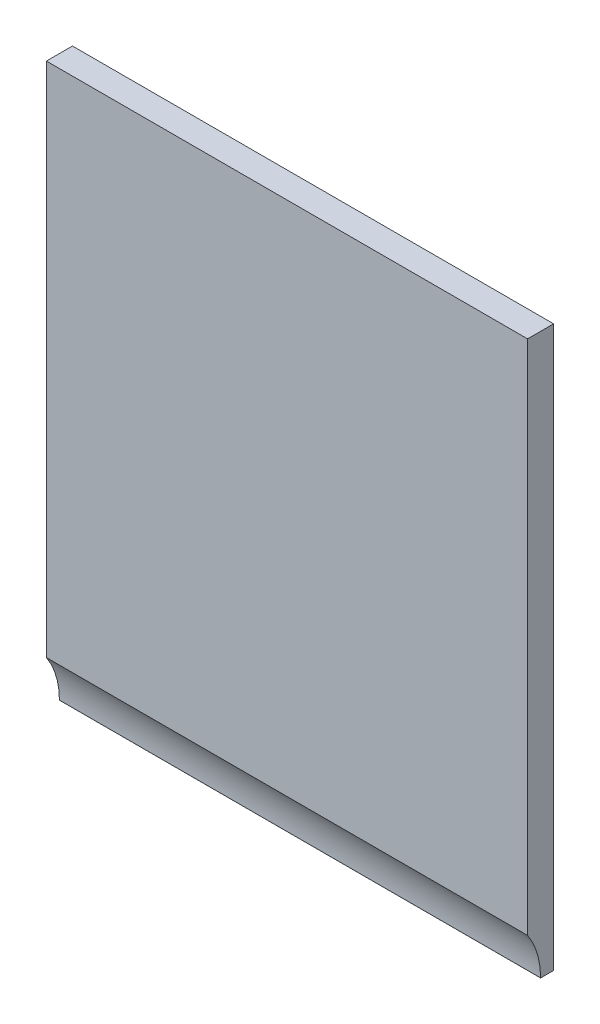
ISO-10303-21;
HEADER;
FILE_DESCRIPTION(('STEP AP214'),'2;1');
FILE_NAME('part.step','',(''),(''),'','','');
FILE_SCHEMA(('AUTOMOTIVE_DESIGN { 1 0 10303 214 1 1 1 1 }'));
ENDSEC;
DATA;
#1=APPLICATION_CONTEXT('core data for automotive mechanical design processes');
#2=APPLICATION_PROTOCOL_DEFINITION('international standard','automotive_design',2000,#1);
#3=PRODUCT_CONTEXT('',#1,'mechanical');
#4=PRODUCT('Part','Part','',(#3));
#5=PRODUCT_RELATED_PRODUCT_CATEGORY('part','',(#4));
#6=PRODUCT_DEFINITION_FORMATION('','',#4);
#7=PRODUCT_DEFINITION_CONTEXT('part definition',#1,'design');
#8=PRODUCT_DEFINITION('design','',#6,#7);
#9=PRODUCT_DEFINITION_SHAPE('','',#8);
#10=(LENGTH_UNIT() NAMED_UNIT(*) SI_UNIT(.MILLI.,.METRE.));
#11=(NAMED_UNIT(*) PLANE_ANGLE_UNIT() SI_UNIT($,.RADIAN.));
#12=(NAMED_UNIT(*) SI_UNIT($,.STERADIAN.) SOLID_ANGLE_UNIT());
#13=UNCERTAINTY_MEASURE_WITH_UNIT(LENGTH_MEASURE(1.E-05),#10,'distance_accuracy_value','');
#14=(GEOMETRIC_REPRESENTATION_CONTEXT(3) GLOBAL_UNCERTAINTY_ASSIGNED_CONTEXT((#13)) GLOBAL_UNIT_ASSIGNED_CONTEXT((#10,
#11,#12)) REPRESENTATION_CONTEXT('',''));
#15=CARTESIAN_POINT('',(0.,0.,0.));
#16=DIRECTION('',(0.,0.,1.));
#17=DIRECTION('',(1.,0.,0.));
#18=AXIS2_PLACEMENT_3D('',#15,#16,#17);
#19=CARTESIAN_POINT('',(-14.5,-17.74,0.75));
#20=DIRECTION('',(0.,0.,-1.));
#21=DIRECTION('',(-1.,0.,0.));
#22=AXIS2_PLACEMENT_3D('',#19,#20,#21);
#23=PLANE('',#22);
#24=DIRECTION('',(1.,0.,0.));
#25=VECTOR('',#24,1.);
#26=CARTESIAN_POINT('',(-14.5,-17.7274685927666,0.749999999999999));
#27=LINE('',#26,#25);
#28=CARTESIAN_POINT('',(13.2,-17.7274685927666,0.749999999999999));
#29=VERTEX_POINT('',#28);
#30=CARTESIAN_POINT('',(-14.5,-17.7274685927666,0.749999999999999));
#31=VERTEX_POINT('',#30);
#32=EDGE_CURVE('E81',#29,#31,#27,.F.);
#33=ORIENTED_EDGE('',*,*,#32,.T.);
#34=DIRECTION('',(0.,1.,0.));
#35=VECTOR('',#34,1.);
#36=CARTESIAN_POINT('',(-14.5,-17.74,0.75));
#37=LINE('',#36,#35);
#38=CARTESIAN_POINT('',(-14.5,-17.74,0.75));
#39=VERTEX_POINT('',#38);
#40=EDGE_CURVE('E139',#39,#31,#37,.T.);
#41=ORIENTED_EDGE('',*,*,#40,.F.);
#42=DIRECTION('',(1.,0.,0.));
#43=VECTOR('',#42,1.);
#44=CARTESIAN_POINT('',(-14.5,-17.74,0.75));
#45=LINE('',#44,#43);
#46=CARTESIAN_POINT('',(13.2,-17.74,0.75));
#47=VERTEX_POINT('',#46);
#48=EDGE_CURVE('E80',#39,#47,#45,.T.);
#49=ORIENTED_EDGE('',*,*,#48,.T.);
#50=DIRECTION('',(0.,1.,0.));
#51=VECTOR('',#50,1.);
#52=CARTESIAN_POINT('',(13.2,-17.74,0.75));
#53=LINE('',#52,#51);
#54=EDGE_CURVE('E65',#29,#47,#53,.F.);
#55=ORIENTED_EDGE('',*,*,#54,.F.);
#56=EDGE_LOOP('',(#33,#41,#49,#55));
#57=FACE_BOUND('',#56,.T.);
#58=ADVANCED_FACE('F17',(#57),#23,.F.);
#59=CARTESIAN_POINT('',(-14.5,-15.24,1.5));
#60=DIRECTION('',(0.,0.,1.));
#61=DIRECTION('',(1.,0.,0.));
#62=AXIS2_PLACEMENT_3D('',#59,#60,#61);
#63=PLANE('',#62);
#64=DIRECTION('',(0.,-1.,0.));
#65=VECTOR('',#64,1.);
#66=CARTESIAN_POINT('',(13.2,14.5,1.5));
#67=LINE('',#66,#65);
#68=CARTESIAN_POINT('',(13.2,-15.24,1.5));
#69=VERTEX_POINT('',#68);
#70=CARTESIAN_POINT('',(13.2,14.5,1.5));
#71=VERTEX_POINT('',#70);
#72=EDGE_CURVE('E73',#69,#71,#67,.F.);
#73=ORIENTED_EDGE('',*,*,#72,.T.);
#74=DIRECTION('',(1.,0.,0.));
#75=VECTOR('',#74,1.);
#76=CARTESIAN_POINT('',(-14.5,14.5,1.5));
#77=LINE('',#76,#75);
#78=CARTESIAN_POINT('',(-14.5,14.5,1.5));
#79=VERTEX_POINT('',#78);
#80=EDGE_CURVE('E111',#71,#79,#77,.F.);
#81=ORIENTED_EDGE('',*,*,#80,.T.);
#82=DIRECTION('',(0.,1.,0.));
#83=VECTOR('',#82,1.);
#84=CARTESIAN_POINT('',(-14.5,14.5,1.5));
#85=LINE('',#84,#83);
#86=CARTESIAN_POINT('',(-14.5,-15.24,1.5));
#87=VERTEX_POINT('',#86);
#88=EDGE_CURVE('E75',#79,#87,#85,.F.);
#89=ORIENTED_EDGE('',*,*,#88,.T.);
#90=DIRECTION('',(1.,0.,0.));
#91=VECTOR('',#90,1.);
#92=CARTESIAN_POINT('',(-14.5,-15.24,1.5));
#93=LINE('',#92,#91);
#94=EDGE_CURVE('E70',#87,#69,#93,.T.);
#95=ORIENTED_EDGE('',*,*,#94,.T.);
#96=EDGE_LOOP('',(#73,#81,#89,#95));
#97=FACE_BOUND('',#96,.T.);
#98=ADVANCED_FACE('F72',(#97),#63,.T.);
#99=CARTESIAN_POINT('',(-14.5,-17.7274685927666,5.25));
#100=DIRECTION('',(1.,0.,0.));
#101=DIRECTION('',(0.,0.,-1.));
#102=AXIS2_PLACEMENT_3D('',#99,#100,#101);
#103=CYLINDRICAL_SURFACE('',#102,4.5);
#104=ORIENTED_EDGE('',*,*,#94,.F.);
#105=CARTESIAN_POINT('',(-14.5,-17.7274685927666,5.25));
#106=DIRECTION('',(1.,0.,0.));
#107=DIRECTION('',(0.,0.,-1.));
#108=AXIS2_PLACEMENT_3D('',#105,#106,#107);
#109=CIRCLE('',#108,4.5);
#110=EDGE_CURVE('E108',#87,#31,#109,.F.);
#111=ORIENTED_EDGE('',*,*,#110,.T.);
#112=ORIENTED_EDGE('',*,*,#32,.F.);
#113=CARTESIAN_POINT('',(13.2,-17.7274685927666,5.25));
#114=DIRECTION('',(1.,0.,0.));
#115=DIRECTION('',(0.,0.,-1.));
#116=AXIS2_PLACEMENT_3D('',#113,#114,#115);
#117=CIRCLE('',#116,4.5);
#118=EDGE_CURVE('E20',#29,#69,#117,.T.);
#119=ORIENTED_EDGE('',*,*,#118,.T.);
#120=EDGE_LOOP('',(#104,#111,#112,#119));
#121=FACE_BOUND('',#120,.T.);
#122=ADVANCED_FACE('F90',(#121),#103,.F.);
#123=CARTESIAN_POINT('',(-14.5,-17.74,0.75));
#124=DIRECTION('',(0.,1.,0.));
#125=DIRECTION('',(0.,0.,1.));
#126=AXIS2_PLACEMENT_3D('',#123,#124,#125);
#127=PLANE('',#126);
#128=DIRECTION('',(1.,0.,0.));
#129=VECTOR('',#128,1.);
#130=CARTESIAN_POINT('',(-14.5,-17.74,0.));
#131=LINE('',#130,#129);
#132=CARTESIAN_POINT('',(-14.5,-17.74,0.));
#133=VERTEX_POINT('',#132);
#134=CARTESIAN_POINT('',(13.2,-17.74,0.));
#135=VERTEX_POINT('',#134);
#136=EDGE_CURVE('E107',#133,#135,#131,.T.);
#137=ORIENTED_EDGE('',*,*,#136,.T.);
#138=DIRECTION('',(0.,0.,1.));
#139=VECTOR('',#138,1.);
#140=CARTESIAN_POINT('',(13.2,-17.74,1.5));
#141=LINE('',#140,#139);
#142=EDGE_CURVE('E91',#135,#47,#141,.T.);
#143=ORIENTED_EDGE('',*,*,#142,.T.);
#144=ORIENTED_EDGE('',*,*,#48,.F.);
#145=DIRECTION('',(0.,0.,1.));
#146=VECTOR('',#145,1.);
#147=CARTESIAN_POINT('',(-14.5,-17.74,1.5));
#148=LINE('',#147,#146);
#149=EDGE_CURVE('E104',#39,#133,#148,.F.);
#150=ORIENTED_EDGE('',*,*,#149,.T.);
#151=EDGE_LOOP('',(#137,#143,#144,#150));
#152=FACE_BOUND('',#151,.T.);
#153=ADVANCED_FACE('F167',(#152),#127,.F.);
#154=CARTESIAN_POINT('',(13.2,14.5,1.5));
#155=DIRECTION('',(-1.,0.,0.));
#156=DIRECTION('',(0.,-1.,0.));
#157=AXIS2_PLACEMENT_3D('',#154,#155,#156);
#158=PLANE('',#157);
#159=DIRECTION('',(0.,0.,-1.));
#160=VECTOR('',#159,1.);
#161=CARTESIAN_POINT('',(13.2,14.5,1.5));
#162=LINE('',#161,#160);
#163=CARTESIAN_POINT('',(13.2,14.5,0.));
#164=VERTEX_POINT('',#163);
#165=EDGE_CURVE('E88',#164,#71,#162,.F.);
#166=ORIENTED_EDGE('',*,*,#165,.T.);
#167=ORIENTED_EDGE('',*,*,#72,.F.);
#168=ORIENTED_EDGE('',*,*,#118,.F.);
#169=ORIENTED_EDGE('',*,*,#54,.T.);
#170=ORIENTED_EDGE('',*,*,#142,.F.);
#171=DIRECTION('',(0.,1.,0.));
#172=VECTOR('',#171,1.);
#173=CARTESIAN_POINT('',(13.2,-15.24,0.));
#174=LINE('',#173,#172);
#175=EDGE_CURVE('E129',#135,#164,#174,.T.);
#176=ORIENTED_EDGE('',*,*,#175,.T.);
#177=EDGE_LOOP('',(#166,#167,#168,#169,#170,#176));
#178=FACE_BOUND('',#177,.T.);
#179=ADVANCED_FACE('F86',(#178),#158,.F.);
#180=CARTESIAN_POINT('',(-14.5,14.5,1.5));
#181=DIRECTION('',(0.,-1.,0.));
#182=DIRECTION('',(0.,0.,-1.));
#183=AXIS2_PLACEMENT_3D('',#180,#181,#182);
#184=PLANE('',#183);
#185=DIRECTION('',(0.,0.,1.));
#186=VECTOR('',#185,1.);
#187=CARTESIAN_POINT('',(-14.5,14.5,1.5));
#188=LINE('',#187,#186);
#189=CARTESIAN_POINT('',(-14.5,14.5,0.));
#190=VERTEX_POINT('',#189);
#191=EDGE_CURVE('E34',#190,#79,#188,.T.);
#192=ORIENTED_EDGE('',*,*,#191,.T.);
#193=ORIENTED_EDGE('',*,*,#80,.F.);
#194=ORIENTED_EDGE('',*,*,#165,.F.);
#195=DIRECTION('',(1.,0.,0.));
#196=VECTOR('',#195,1.);
#197=CARTESIAN_POINT('',(-14.5,14.5,0.));
#198=LINE('',#197,#196);
#199=EDGE_CURVE('E26',#164,#190,#198,.F.);
#200=ORIENTED_EDGE('',*,*,#199,.T.);
#201=EDGE_LOOP('',(#192,#193,#194,#200));
#202=FACE_BOUND('',#201,.T.);
#203=ADVANCED_FACE('F158',(#202),#184,.F.);
#204=CARTESIAN_POINT('',(-14.5,14.5,1.5));
#205=DIRECTION('',(1.,0.,0.));
#206=DIRECTION('',(0.,1.,0.));
#207=AXIS2_PLACEMENT_3D('',#204,#205,#206);
#208=PLANE('',#207);
#209=ORIENTED_EDGE('',*,*,#149,.F.);
#210=ORIENTED_EDGE('',*,*,#40,.T.);
#211=ORIENTED_EDGE('',*,*,#110,.F.);
#212=ORIENTED_EDGE('',*,*,#88,.F.);
#213=ORIENTED_EDGE('',*,*,#191,.F.);
#214=DIRECTION('',(0.,1.,0.));
#215=VECTOR('',#214,1.);
#216=CARTESIAN_POINT('',(-14.5,-15.24,0.));
#217=LINE('',#216,#215);
#218=EDGE_CURVE('E11',#190,#133,#217,.F.);
#219=ORIENTED_EDGE('',*,*,#218,.T.);
#220=EDGE_LOOP('',(#209,#210,#211,#212,#213,#219));
#221=FACE_BOUND('',#220,.T.);
#222=ADVANCED_FACE('F145',(#221),#208,.F.);
#223=CARTESIAN_POINT('',(-14.5,-15.24,0.));
#224=DIRECTION('',(0.,0.,1.));
#225=DIRECTION('',(1.,0.,0.));
#226=AXIS2_PLACEMENT_3D('',#223,#224,#225);
#227=PLANE('',#226);
#228=ORIENTED_EDGE('',*,*,#199,.F.);
#229=ORIENTED_EDGE('',*,*,#175,.F.);
#230=ORIENTED_EDGE('',*,*,#136,.F.);
#231=ORIENTED_EDGE('',*,*,#218,.F.);
#232=EDGE_LOOP('',(#228,#229,#230,#231));
#233=FACE_BOUND('',#232,.T.);
#234=ADVANCED_FACE('F151',(#233),#227,.F.);
#235=CLOSED_SHELL('',(#58,#98,#122,#153,#179,#203,#222,#234));
#236=MANIFOLD_SOLID_BREP('B1',#235);
#237=ADVANCED_BREP_SHAPE_REPRESENTATION('',(#18,#236),#14);
#238=SHAPE_DEFINITION_REPRESENTATION(#9,#237);
ENDSEC;
END-ISO-10303-21;
